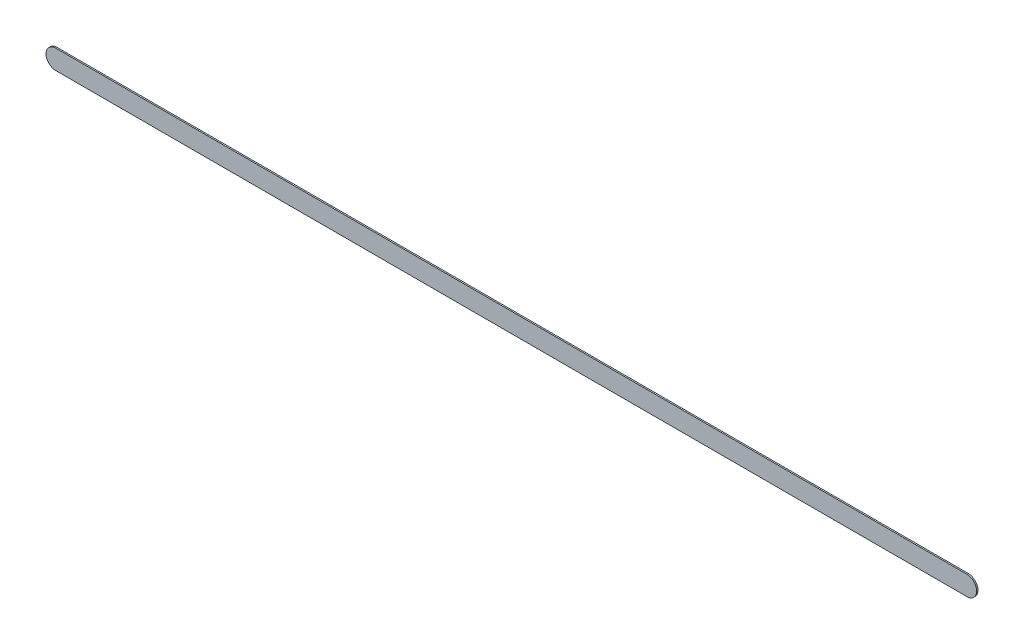
ISO-10303-21;
HEADER;
FILE_DESCRIPTION(('STEP AP214'),'2;1');
FILE_NAME('part.step','',(''),(''),'','','');
FILE_SCHEMA(('AUTOMOTIVE_DESIGN { 1 0 10303 214 1 1 1 1 }'));
ENDSEC;
DATA;
#1=APPLICATION_CONTEXT('core data for automotive mechanical design processes');
#2=APPLICATION_PROTOCOL_DEFINITION('international standard','automotive_design',2000,#1);
#3=PRODUCT_CONTEXT('',#1,'mechanical');
#4=PRODUCT('Part','Part','',(#3));
#5=PRODUCT_RELATED_PRODUCT_CATEGORY('part','',(#4));
#6=PRODUCT_DEFINITION_FORMATION('','',#4);
#7=PRODUCT_DEFINITION_CONTEXT('part definition',#1,'design');
#8=PRODUCT_DEFINITION('design','',#6,#7);
#9=PRODUCT_DEFINITION_SHAPE('','',#8);
#10=(LENGTH_UNIT() NAMED_UNIT(*) SI_UNIT(.MILLI.,.METRE.));
#11=(NAMED_UNIT(*) PLANE_ANGLE_UNIT() SI_UNIT($,.RADIAN.));
#12=(NAMED_UNIT(*) SI_UNIT($,.STERADIAN.) SOLID_ANGLE_UNIT());
#13=UNCERTAINTY_MEASURE_WITH_UNIT(LENGTH_MEASURE(1.E-05),#10,'distance_accuracy_value','');
#14=(GEOMETRIC_REPRESENTATION_CONTEXT(3) GLOBAL_UNCERTAINTY_ASSIGNED_CONTEXT((#13)) GLOBAL_UNIT_ASSIGNED_CONTEXT((#10,
#11,#12)) REPRESENTATION_CONTEXT('',''));
#15=CARTESIAN_POINT('',(0.,0.,0.));
#16=DIRECTION('',(0.,0.,1.));
#17=DIRECTION('',(1.,0.,0.));
#18=AXIS2_PLACEMENT_3D('',#15,#16,#17);
#19=CARTESIAN_POINT('',(63.4000002,91.74999938,0.));
#20=DIRECTION('',(0.,1.,0.));
#21=DIRECTION('',(1.,0.,0.));
#22=AXIS2_PLACEMENT_3D('',#19,#20,#21);
#23=PLANE('',#22);
#24=DIRECTION('',(1.,0.,0.));
#25=VECTOR('',#24,1.);
#26=CARTESIAN_POINT('',(63.4000002,91.74999938,0.03556));
#27=LINE('',#26,#25);
#28=CARTESIAN_POINT('',(63.4000002,91.74999938,0.03556));
#29=VERTEX_POINT('',#28);
#30=CARTESIAN_POINT('',(86.89999892,91.74999938,0.03556));
#31=VERTEX_POINT('',#30);
#32=EDGE_CURVE('E11',#29,#31,#27,.T.);
#33=ORIENTED_EDGE('',*,*,#32,.F.);
#34=DIRECTION('',(0.,0.,1.));
#35=VECTOR('',#34,1.);
#36=CARTESIAN_POINT('',(63.4000002,91.74999938,0.));
#37=LINE('',#36,#35);
#38=CARTESIAN_POINT('',(63.4000002,91.74999938,0.));
#39=VERTEX_POINT('',#38);
#40=EDGE_CURVE('E24',#39,#29,#37,.T.);
#41=ORIENTED_EDGE('',*,*,#40,.F.);
#42=DIRECTION('',(1.,0.,0.));
#43=VECTOR('',#42,1.);
#44=CARTESIAN_POINT('',(63.4000002,91.74999938,0.));
#45=LINE('',#44,#43);
#46=CARTESIAN_POINT('',(86.89999892,91.74999938,0.));
#47=VERTEX_POINT('',#46);
#48=EDGE_CURVE('E75',#39,#47,#45,.T.);
#49=ORIENTED_EDGE('',*,*,#48,.T.);
#50=DIRECTION('',(0.,0.,1.));
#51=VECTOR('',#50,1.);
#52=CARTESIAN_POINT('',(86.89999892,91.74999938,0.));
#53=LINE('',#52,#51);
#54=EDGE_CURVE('E37',#47,#31,#53,.T.);
#55=ORIENTED_EDGE('',*,*,#54,.T.);
#56=EDGE_LOOP('',(#33,#41,#49,#55));
#57=FACE_BOUND('',#56,.T.);
#58=ADVANCED_FACE('F17',(#57),#23,.F.);
#59=CARTESIAN_POINT('',(86.89999892,91.99999888,0.));
#60=DIRECTION('',(0.,0.,-1.));
#61=DIRECTION('',(0.,-1.,0.));
#62=AXIS2_PLACEMENT_3D('',#59,#60,#61);
#63=CYLINDRICAL_SURFACE('',#62,0.249999500000001);
#64=CARTESIAN_POINT('',(86.89999892,91.99999888,0.03556));
#65=DIRECTION('',(0.,0.,1.));
#66=DIRECTION('',(0.,-1.,0.));
#67=AXIS2_PLACEMENT_3D('',#64,#65,#66);
#68=CIRCLE('',#67,0.249999500000001);
#69=CARTESIAN_POINT('',(86.89999892,92.24999838,0.03556));
#70=VERTEX_POINT('',#69);
#71=EDGE_CURVE('E83',#31,#70,#68,.T.);
#72=ORIENTED_EDGE('',*,*,#71,.F.);
#73=ORIENTED_EDGE('',*,*,#54,.F.);
#74=CARTESIAN_POINT('',(86.89999892,91.99999888,0.));
#75=DIRECTION('',(0.,0.,1.));
#76=DIRECTION('',(0.,-1.,0.));
#77=AXIS2_PLACEMENT_3D('',#74,#75,#76);
#78=CIRCLE('',#77,0.249999500000001);
#79=CARTESIAN_POINT('',(86.89999892,92.24999838,0.));
#80=VERTEX_POINT('',#79);
#81=EDGE_CURVE('E81',#47,#80,#78,.T.);
#82=ORIENTED_EDGE('',*,*,#81,.T.);
#83=DIRECTION('',(0.,0.,1.));
#84=VECTOR('',#83,1.);
#85=CARTESIAN_POINT('',(86.89999892,92.24999838,0.));
#86=LINE('',#85,#84);
#87=EDGE_CURVE('E67',#80,#70,#86,.T.);
#88=ORIENTED_EDGE('',*,*,#87,.T.);
#89=EDGE_LOOP('',(#72,#73,#82,#88));
#90=FACE_BOUND('',#89,.T.);
#91=ADVANCED_FACE('F89',(#90),#63,.T.);
#92=CARTESIAN_POINT('',(86.89999892,92.24999838,0.));
#93=DIRECTION('',(0.,-1.,0.));
#94=DIRECTION('',(-1.,0.,0.));
#95=AXIS2_PLACEMENT_3D('',#92,#93,#94);
#96=PLANE('',#95);
#97=DIRECTION('',(-1.,0.,0.));
#98=VECTOR('',#97,1.);
#99=CARTESIAN_POINT('',(86.89999892,92.24999838,0.03556));
#100=LINE('',#99,#98);
#101=CARTESIAN_POINT('',(63.4000002,92.24999838,0.03556));
#102=VERTEX_POINT('',#101);
#103=EDGE_CURVE('E71',#70,#102,#100,.T.);
#104=ORIENTED_EDGE('',*,*,#103,.F.);
#105=ORIENTED_EDGE('',*,*,#87,.F.);
#106=DIRECTION('',(-1.,0.,0.));
#107=VECTOR('',#106,1.);
#108=CARTESIAN_POINT('',(86.89999892,92.24999838,0.));
#109=LINE('',#108,#107);
#110=CARTESIAN_POINT('',(63.4000002,92.24999838,0.));
#111=VERTEX_POINT('',#110);
#112=EDGE_CURVE('E63',#80,#111,#109,.T.);
#113=ORIENTED_EDGE('',*,*,#112,.T.);
#114=DIRECTION('',(0.,0.,1.));
#115=VECTOR('',#114,1.);
#116=CARTESIAN_POINT('',(63.4000002,92.24999838,0.));
#117=LINE('',#116,#115);
#118=EDGE_CURVE('E53',#111,#102,#117,.T.);
#119=ORIENTED_EDGE('',*,*,#118,.T.);
#120=EDGE_LOOP('',(#104,#105,#113,#119));
#121=FACE_BOUND('',#120,.T.);
#122=ADVANCED_FACE('F66',(#121),#96,.F.);
#123=CARTESIAN_POINT('',(63.4000002,91.99999888,0.));
#124=DIRECTION('',(0.,0.,-1.));
#125=DIRECTION('',(0.,1.,0.));
#126=AXIS2_PLACEMENT_3D('',#123,#124,#125);
#127=CYLINDRICAL_SURFACE('',#126,0.249999500000001);
#128=CARTESIAN_POINT('',(63.4000002,91.99999888,0.03556));
#129=DIRECTION('',(0.,0.,1.));
#130=DIRECTION('',(0.,1.,0.));
#131=AXIS2_PLACEMENT_3D('',#128,#129,#130);
#132=CIRCLE('',#131,0.249999500000001);
#133=EDGE_CURVE('E59',#102,#29,#132,.T.);
#134=ORIENTED_EDGE('',*,*,#133,.F.);
#135=ORIENTED_EDGE('',*,*,#118,.F.);
#136=CARTESIAN_POINT('',(63.4000002,91.99999888,0.));
#137=DIRECTION('',(0.,0.,1.));
#138=DIRECTION('',(0.,1.,0.));
#139=AXIS2_PLACEMENT_3D('',#136,#137,#138);
#140=CIRCLE('',#139,0.249999500000001);
#141=EDGE_CURVE('E57',#111,#39,#140,.T.);
#142=ORIENTED_EDGE('',*,*,#141,.T.);
#143=ORIENTED_EDGE('',*,*,#40,.T.);
#144=EDGE_LOOP('',(#134,#135,#142,#143));
#145=FACE_BOUND('',#144,.T.);
#146=ADVANCED_FACE('F55',(#145),#127,.T.);
#147=CARTESIAN_POINT('',(63.4000002,91.74999938,0.));
#148=DIRECTION('',(0.,0.,-1.));
#149=DIRECTION('',(-1.,0.,0.));
#150=AXIS2_PLACEMENT_3D('',#147,#148,#149);
#151=PLANE('',#150);
#152=ORIENTED_EDGE('',*,*,#141,.F.);
#153=ORIENTED_EDGE('',*,*,#112,.F.);
#154=ORIENTED_EDGE('',*,*,#81,.F.);
#155=ORIENTED_EDGE('',*,*,#48,.F.);
#156=EDGE_LOOP('',(#152,#153,#154,#155));
#157=FACE_BOUND('',#156,.T.);
#158=ADVANCED_FACE('F74',(#157),#151,.T.);
#159=CARTESIAN_POINT('',(63.4000002,91.74999938,0.03556));
#160=DIRECTION('',(0.,0.,-1.));
#161=DIRECTION('',(-1.,0.,0.));
#162=AXIS2_PLACEMENT_3D('',#159,#160,#161);
#163=PLANE('',#162);
#164=ORIENTED_EDGE('',*,*,#32,.T.);
#165=ORIENTED_EDGE('',*,*,#71,.T.);
#166=ORIENTED_EDGE('',*,*,#103,.T.);
#167=ORIENTED_EDGE('',*,*,#133,.T.);
#168=EDGE_LOOP('',(#164,#165,#166,#167));
#169=FACE_BOUND('',#168,.T.);
#170=ADVANCED_FACE('F91',(#169),#163,.F.);
#171=CLOSED_SHELL('',(#58,#91,#122,#146,#158,#170));
#172=MANIFOLD_SOLID_BREP('B1',#171);
#173=ADVANCED_BREP_SHAPE_REPRESENTATION('',(#18,#172),#14);
#174=SHAPE_DEFINITION_REPRESENTATION(#9,#173);
ENDSEC;
END-ISO-10303-21;
